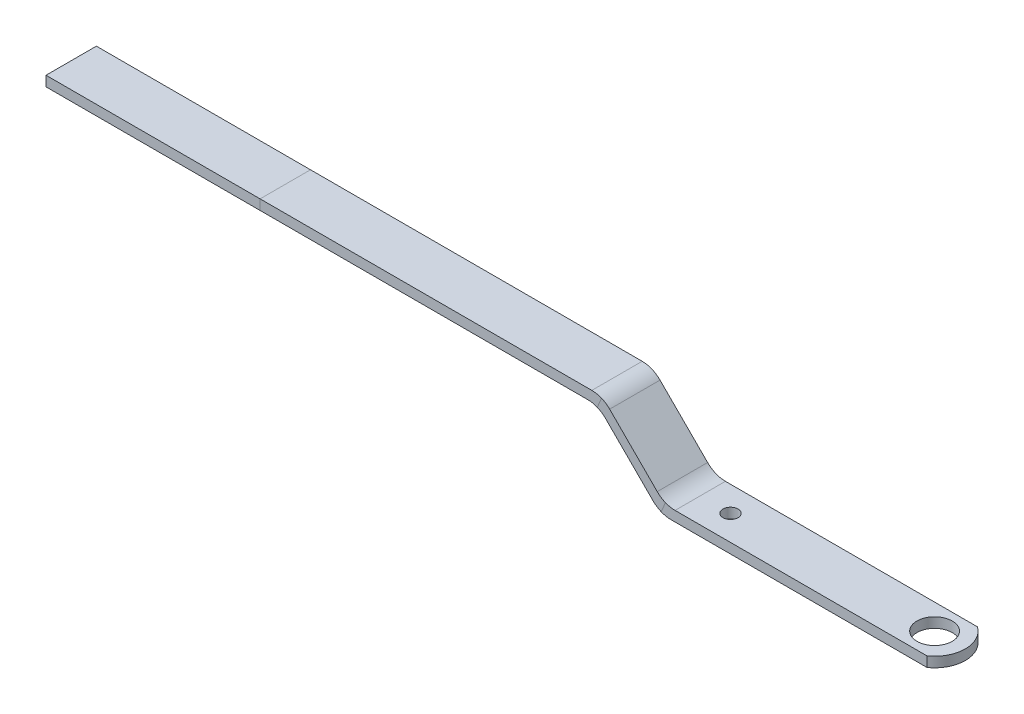
ISO-10303-21;
HEADER;
FILE_DESCRIPTION(('STEP AP214'),'2;1');
FILE_NAME('part.step','',(''),(''),'','','');
FILE_SCHEMA(('AUTOMOTIVE_DESIGN { 1 0 10303 214 1 1 1 1 }'));
ENDSEC;
DATA;
#1=APPLICATION_CONTEXT('core data for automotive mechanical design processes');
#2=APPLICATION_PROTOCOL_DEFINITION('international standard','automotive_design',2000,#1);
#3=PRODUCT_CONTEXT('',#1,'mechanical');
#4=PRODUCT('Part','Part','',(#3));
#5=PRODUCT_RELATED_PRODUCT_CATEGORY('part','',(#4));
#6=PRODUCT_DEFINITION_FORMATION('','',#4);
#7=PRODUCT_DEFINITION_CONTEXT('part definition',#1,'design');
#8=PRODUCT_DEFINITION('design','',#6,#7);
#9=PRODUCT_DEFINITION_SHAPE('','',#8);
#10=(LENGTH_UNIT() NAMED_UNIT(*) SI_UNIT(.MILLI.,.METRE.));
#11=(NAMED_UNIT(*) PLANE_ANGLE_UNIT() SI_UNIT($,.RADIAN.));
#12=(NAMED_UNIT(*) SI_UNIT($,.STERADIAN.) SOLID_ANGLE_UNIT());
#13=UNCERTAINTY_MEASURE_WITH_UNIT(LENGTH_MEASURE(1.E-05),#10,'distance_accuracy_value','');
#14=(GEOMETRIC_REPRESENTATION_CONTEXT(3) GLOBAL_UNCERTAINTY_ASSIGNED_CONTEXT((#13)) GLOBAL_UNIT_ASSIGNED_CONTEXT((#10,
#11,#12)) REPRESENTATION_CONTEXT('',''));
#15=CARTESIAN_POINT('',(0.,0.,0.));
#16=DIRECTION('',(0.,0.,1.));
#17=DIRECTION('',(1.,0.,0.));
#18=AXIS2_PLACEMENT_3D('',#15,#16,#17);
#19=CARTESIAN_POINT('',(-175.748737341529,22.748737341529,0.));
#20=DIRECTION('',(0.,-1.,0.));
#21=DIRECTION('',(1.,0.,0.));
#22=AXIS2_PLACEMENT_3D('',#19,#20,#21);
#23=DEGENERATE_TOROIDAL_SURFACE('',#22,1.99999999999999,2.,.T.);
#24=CARTESIAN_POINT('',(-175.748737341529,20.748737341529,0.));
#25=DIRECTION('',(0.,-1.,0.));
#26=DIRECTION('',(1.,0.,0.));
#27=AXIS2_PLACEMENT_3D('',#24,#25,#26);
#28=CIRCLE('',#27,1.99999999999999);
#29=CARTESIAN_POINT('',(-173.748737341529,20.748737341529,0.));
#30=VERTEX_POINT('',#29);
#31=EDGE_CURVE('E11',#30,#30,#28,.T.);
#32=ORIENTED_EDGE('',*,*,#31,.F.);
#33=EDGE_LOOP('',(#32));
#34=FACE_BOUND('',#33,.T.);
#35=CARTESIAN_POINT('',(-175.748737341529,22.748737341529,0.));
#36=DIRECTION('',(0.,1.,0.));
#37=DIRECTION('',(-1.,0.,0.));
#38=AXIS2_PLACEMENT_3D('',#35,#36,#37);
#39=CIRCLE('',#38,3.99999999999999);
#40=CARTESIAN_POINT('',(-179.748737341529,22.748737341529,0.));
#41=VERTEX_POINT('',#40);
#42=EDGE_CURVE('E47',#41,#41,#39,.F.);
#43=ORIENTED_EDGE('',*,*,#42,.T.);
#44=EDGE_LOOP('',(#43));
#45=FACE_BOUND('',#44,.T.);
#46=ADVANCED_FACE('F40',(#34,#45),#23,.T.);
#47=CARTESIAN_POINT('',(-244.748737341529,24.748737341529,0.));
#48=DIRECTION('',(-1.,0.,0.));
#49=DIRECTION('',(0.,0.,1.));
#50=AXIS2_PLACEMENT_3D('',#47,#48,#49);
#51=PLANE('',#50);
#52=DIRECTION('',(0.,1.,0.));
#53=VECTOR('',#52,1.);
#54=CARTESIAN_POINT('',(-244.748737341529,22.748737341529,-10.));
#55=LINE('',#54,#53);
#56=CARTESIAN_POINT('',(-244.748737341529,22.748737341529,-10.));
#57=VERTEX_POINT('',#56);
#58=CARTESIAN_POINT('',(-244.748737341529,26.748737341529,-10.));
#59=VERTEX_POINT('',#58);
#60=EDGE_CURVE('E251',#57,#59,#55,.T.);
#61=ORIENTED_EDGE('',*,*,#60,.F.);
#62=DIRECTION('',(0.,0.,-1.));
#63=VECTOR('',#62,1.);
#64=CARTESIAN_POINT('',(-244.748737341529,22.748737341529,10.));
#65=LINE('',#64,#63);
#66=CARTESIAN_POINT('',(-244.748737341529,22.748737341529,10.));
#67=VERTEX_POINT('',#66);
#68=EDGE_CURVE('E192',#67,#57,#65,.T.);
#69=ORIENTED_EDGE('',*,*,#68,.F.);
#70=DIRECTION('',(0.,-1.,0.));
#71=VECTOR('',#70,1.);
#72=CARTESIAN_POINT('',(-244.748737341529,22.748737341529,10.));
#73=LINE('',#72,#71);
#74=CARTESIAN_POINT('',(-244.748737341529,26.748737341529,10.));
#75=VERTEX_POINT('',#74);
#76=EDGE_CURVE('E235',#75,#67,#73,.T.);
#77=ORIENTED_EDGE('',*,*,#76,.F.);
#78=DIRECTION('',(0.,0.,1.));
#79=VECTOR('',#78,1.);
#80=CARTESIAN_POINT('',(-244.748737341529,26.748737341529,10.));
#81=LINE('',#80,#79);
#82=EDGE_CURVE('E243',#59,#75,#81,.T.);
#83=ORIENTED_EDGE('',*,*,#82,.F.);
#84=EDGE_LOOP('',(#61,#69,#77,#83));
#85=FACE_BOUND('',#84,.T.);
#86=ADVANCED_FACE('F333',(#85),#51,.T.);
#87=CARTESIAN_POINT('',(-23.7374675043085,22.748737341529,-10.));
#88=DIRECTION('',(0.,0.,1.));
#89=DIRECTION('',(1.,0.,0.));
#90=AXIS2_PLACEMENT_3D('',#87,#88,#89);
#91=PLANE('',#90);
#92=DIRECTION('',(-1.,0.,0.));
#93=VECTOR('',#92,1.);
#94=CARTESIAN_POINT('',(-23.7374675043085,26.748737341529,-10.));
#95=LINE('',#94,#93);
#96=CARTESIAN_POINT('',(-28.062445840514,26.748737341529,-10.));
#97=VERTEX_POINT('',#96);
#98=CARTESIAN_POINT('',(-159.748737341529,26.748737341529,-10.));
#99=VERTEX_POINT('',#98);
#100=EDGE_CURVE('E261',#97,#99,#95,.T.);
#101=ORIENTED_EDGE('',*,*,#100,.F.);
#102=CARTESIAN_POINT('',(-28.062445840514,16.748737341529,-10.));
#103=DIRECTION('',(0.,0.,1.));
#104=DIRECTION('',(1.,0.,0.));
#105=AXIS2_PLACEMENT_3D('',#102,#103,#104);
#106=CIRCLE('',#105,10.);
#107=CARTESIAN_POINT('',(-24.2356115168632,25.9875326666419,-10.));
#108=VERTEX_POINT('',#107);
#109=EDGE_CURVE('E273',#97,#108,#106,.F.);
#110=ORIENTED_EDGE('',*,*,#109,.T.);
#111=DIRECTION('',(-0.382683432365087,-0.923879532511288,0.));
#112=VECTOR('',#111,1.);
#113=CARTESIAN_POINT('',(-30.7295724908075,10.3097240098238,-10.));
#114=LINE('',#113,#112);
#115=CARTESIAN_POINT('',(-25.8924657663555,21.9875326666419,-10.));
#116=VERTEX_POINT('',#115);
#117=EDGE_CURVE('E54',#108,#116,#114,.T.);
#118=ORIENTED_EDGE('',*,*,#117,.T.);
#119=CARTESIAN_POINT('',(-29.7193000900064,12.748737341529,-10.));
#120=DIRECTION('',(0.,0.,1.));
#121=DIRECTION('',(1.,0.,0.));
#122=AXIS2_PLACEMENT_3D('',#119,#120,#121);
#123=CIRCLE('',#122,10.);
#124=CARTESIAN_POINT('',(-29.7193000900064,22.748737341529,-10.));
#125=VERTEX_POINT('',#124);
#126=EDGE_CURVE('E314',#116,#125,#123,.T.);
#127=ORIENTED_EDGE('',*,*,#126,.T.);
#128=DIRECTION('',(-1.,0.,0.));
#129=VECTOR('',#128,1.);
#130=CARTESIAN_POINT('',(-23.7374675043085,22.748737341529,-10.));
#131=LINE('',#130,#129);
#132=CARTESIAN_POINT('',(-159.748737341529,22.748737341529,-10.));
#133=VERTEX_POINT('',#132);
#134=EDGE_CURVE('E216',#125,#133,#131,.T.);
#135=ORIENTED_EDGE('',*,*,#134,.T.);
#136=DIRECTION('',(0.,1.,0.));
#137=VECTOR('',#136,1.);
#138=CARTESIAN_POINT('',(-159.748737341529,22.748737341529,-10.));
#139=LINE('',#138,#137);
#140=EDGE_CURVE('E248',#133,#99,#139,.T.);
#141=ORIENTED_EDGE('',*,*,#140,.T.);
#142=EDGE_LOOP('',(#101,#110,#118,#127,#135,#141));
#143=FACE_BOUND('',#142,.T.);
#144=ADVANCED_FACE('F340',(#143),#91,.F.);
#145=CARTESIAN_POINT('',(-23.7374675043085,26.748737341529,10.));
#146=DIRECTION('',(0.,-1.,0.));
#147=DIRECTION('',(1.,0.,0.));
#148=AXIS2_PLACEMENT_3D('',#145,#146,#147);
#149=PLANE('',#148);
#150=DIRECTION('',(-1.,0.,0.));
#151=VECTOR('',#150,1.);
#152=CARTESIAN_POINT('',(-23.7374675043085,26.748737341529,10.));
#153=LINE('',#152,#151);
#154=CARTESIAN_POINT('',(-28.062445840514,26.748737341529,10.));
#155=VERTEX_POINT('',#154);
#156=CARTESIAN_POINT('',(-159.748737341529,26.748737341529,10.));
#157=VERTEX_POINT('',#156);
#158=EDGE_CURVE('E259',#155,#157,#153,.T.);
#159=ORIENTED_EDGE('',*,*,#158,.F.);
#160=DIRECTION('',(0.,0.,-1.));
#161=VECTOR('',#160,1.);
#162=CARTESIAN_POINT('',(-28.062445840514,26.748737341529,10.));
#163=LINE('',#162,#161);
#164=EDGE_CURVE('E270',#155,#97,#163,.T.);
#165=ORIENTED_EDGE('',*,*,#164,.T.);
#166=ORIENTED_EDGE('',*,*,#100,.T.);
#167=DIRECTION('',(0.,0.,1.));
#168=VECTOR('',#167,1.);
#169=CARTESIAN_POINT('',(-159.748737341529,26.748737341529,10.));
#170=LINE('',#169,#168);
#171=EDGE_CURVE('E240',#99,#157,#170,.T.);
#172=ORIENTED_EDGE('',*,*,#171,.T.);
#173=EDGE_LOOP('',(#159,#165,#166,#172));
#174=FACE_BOUND('',#173,.T.);
#175=ADVANCED_FACE('F362',(#174),#149,.F.);
#176=CARTESIAN_POINT('',(-23.7374675043085,22.748737341529,10.));
#177=DIRECTION('',(0.,0.,-1.));
#178=DIRECTION('',(-1.,0.,0.));
#179=AXIS2_PLACEMENT_3D('',#176,#177,#178);
#180=PLANE('',#179);
#181=DIRECTION('',(0.382683432365087,0.923879532511288,0.));
#182=VECTOR('',#181,1.);
#183=CARTESIAN_POINT('',(-30.7295724908075,10.3097240098238,10.));
#184=LINE('',#183,#182);
#185=CARTESIAN_POINT('',(-25.8924657663555,21.9875326666419,10.));
#186=VERTEX_POINT('',#185);
#187=CARTESIAN_POINT('',(-24.2356115168632,25.9875326666419,10.));
#188=VERTEX_POINT('',#187);
#189=EDGE_CURVE('E62',#186,#188,#184,.T.);
#190=ORIENTED_EDGE('',*,*,#189,.T.);
#191=CARTESIAN_POINT('',(-28.062445840514,16.748737341529,10.));
#192=DIRECTION('',(0.,0.,-1.));
#193=DIRECTION('',(-1.,0.,0.));
#194=AXIS2_PLACEMENT_3D('',#191,#192,#193);
#195=CIRCLE('',#194,10.);
#196=EDGE_CURVE('E283',#188,#155,#195,.F.);
#197=ORIENTED_EDGE('',*,*,#196,.T.);
#198=ORIENTED_EDGE('',*,*,#158,.T.);
#199=DIRECTION('',(0.,-1.,0.));
#200=VECTOR('',#199,1.);
#201=CARTESIAN_POINT('',(-159.748737341529,22.748737341529,10.));
#202=LINE('',#201,#200);
#203=CARTESIAN_POINT('',(-159.748737341529,22.748737341529,10.));
#204=VERTEX_POINT('',#203);
#205=EDGE_CURVE('E231',#157,#204,#202,.T.);
#206=ORIENTED_EDGE('',*,*,#205,.T.);
#207=DIRECTION('',(-1.,0.,0.));
#208=VECTOR('',#207,1.);
#209=CARTESIAN_POINT('',(-23.7374675043085,22.748737341529,10.));
#210=LINE('',#209,#208);
#211=CARTESIAN_POINT('',(-29.7193000900064,22.748737341529,10.));
#212=VERTEX_POINT('',#211);
#213=EDGE_CURVE('E257',#212,#204,#210,.T.);
#214=ORIENTED_EDGE('',*,*,#213,.F.);
#215=CARTESIAN_POINT('',(-29.7193000900064,12.748737341529,10.));
#216=DIRECTION('',(0.,0.,-1.));
#217=DIRECTION('',(-1.,0.,0.));
#218=AXIS2_PLACEMENT_3D('',#215,#216,#217);
#219=CIRCLE('',#218,10.);
#220=EDGE_CURVE('E308',#212,#186,#219,.T.);
#221=ORIENTED_EDGE('',*,*,#220,.T.);
#222=EDGE_LOOP('',(#190,#197,#198,#206,#214,#221));
#223=FACE_BOUND('',#222,.T.);
#224=ADVANCED_FACE('F353',(#223),#180,.F.);
#225=CARTESIAN_POINT('',(-23.7374675043085,22.748737341529,10.));
#226=DIRECTION('',(0.,1.,0.));
#227=DIRECTION('',(-1.,0.,0.));
#228=AXIS2_PLACEMENT_3D('',#225,#226,#227);
#229=PLANE('',#228);
#230=ORIENTED_EDGE('',*,*,#134,.F.);
#231=DIRECTION('',(0.,0.,1.));
#232=VECTOR('',#231,1.);
#233=CARTESIAN_POINT('',(-29.7193000900064,22.748737341529,10.));
#234=LINE('',#233,#232);
#235=EDGE_CURVE('E296',#125,#212,#234,.T.);
#236=ORIENTED_EDGE('',*,*,#235,.T.);
#237=ORIENTED_EDGE('',*,*,#213,.T.);
#238=DIRECTION('',(0.,0.,-1.));
#239=VECTOR('',#238,1.);
#240=CARTESIAN_POINT('',(-159.748737341529,22.748737341529,10.));
#241=LINE('',#240,#239);
#242=EDGE_CURVE('E228',#204,#133,#241,.T.);
#243=ORIENTED_EDGE('',*,*,#242,.T.);
#244=EDGE_LOOP('',(#230,#236,#237,#243));
#245=FACE_BOUND('',#244,.T.);
#246=ADVANCED_FACE('F345',(#245),#229,.F.);
#247=CARTESIAN_POINT('',(-159.748737341529,22.748737341529,-10.));
#248=DIRECTION('',(0.,0.,1.));
#249=DIRECTION('',(1.,0.,0.));
#250=AXIS2_PLACEMENT_3D('',#247,#248,#249);
#251=PLANE('',#250);
#252=DIRECTION('',(-1.,0.,0.));
#253=VECTOR('',#252,1.);
#254=CARTESIAN_POINT('',(-159.748737341529,26.748737341529,-10.));
#255=LINE('',#254,#253);
#256=EDGE_CURVE('E245',#99,#59,#255,.T.);
#257=ORIENTED_EDGE('',*,*,#256,.F.);
#258=ORIENTED_EDGE('',*,*,#140,.F.);
#259=DIRECTION('',(-1.,0.,0.));
#260=VECTOR('',#259,1.);
#261=CARTESIAN_POINT('',(-159.748737341529,22.748737341529,-10.));
#262=LINE('',#261,#260);
#263=EDGE_CURVE('E232',#133,#57,#262,.T.);
#264=ORIENTED_EDGE('',*,*,#263,.T.);
#265=ORIENTED_EDGE('',*,*,#60,.T.);
#266=EDGE_LOOP('',(#257,#258,#264,#265));
#267=FACE_BOUND('',#266,.T.);
#268=ADVANCED_FACE('F337',(#267),#251,.F.);
#269=CARTESIAN_POINT('',(-159.748737341529,26.748737341529,10.));
#270=DIRECTION('',(0.,-1.,0.));
#271=DIRECTION('',(1.,0.,0.));
#272=AXIS2_PLACEMENT_3D('',#269,#270,#271);
#273=PLANE('',#272);
#274=DIRECTION('',(-1.,0.,0.));
#275=VECTOR('',#274,1.);
#276=CARTESIAN_POINT('',(-159.748737341529,26.748737341529,10.));
#277=LINE('',#276,#275);
#278=EDGE_CURVE('E237',#157,#75,#277,.T.);
#279=ORIENTED_EDGE('',*,*,#278,.F.);
#280=ORIENTED_EDGE('',*,*,#171,.F.);
#281=ORIENTED_EDGE('',*,*,#256,.T.);
#282=ORIENTED_EDGE('',*,*,#82,.T.);
#283=EDGE_LOOP('',(#279,#280,#281,#282));
#284=FACE_BOUND('',#283,.T.);
#285=ADVANCED_FACE('F359',(#284),#273,.F.);
#286=CARTESIAN_POINT('',(-159.748737341529,22.748737341529,10.));
#287=DIRECTION('',(0.,0.,-1.));
#288=DIRECTION('',(-1.,0.,0.));
#289=AXIS2_PLACEMENT_3D('',#286,#287,#288);
#290=PLANE('',#289);
#291=DIRECTION('',(-1.,0.,0.));
#292=VECTOR('',#291,1.);
#293=CARTESIAN_POINT('',(-159.748737341529,22.748737341529,10.));
#294=LINE('',#293,#292);
#295=EDGE_CURVE('E227',#204,#67,#294,.T.);
#296=ORIENTED_EDGE('',*,*,#295,.F.);
#297=ORIENTED_EDGE('',*,*,#205,.F.);
#298=ORIENTED_EDGE('',*,*,#278,.T.);
#299=ORIENTED_EDGE('',*,*,#76,.T.);
#300=EDGE_LOOP('',(#296,#297,#298,#299));
#301=FACE_BOUND('',#300,.T.);
#302=ADVANCED_FACE('F323',(#301),#290,.F.);
#303=CARTESIAN_POINT('',(-159.748737341529,22.748737341529,10.));
#304=DIRECTION('',(0.,1.,0.));
#305=DIRECTION('',(-1.,0.,0.));
#306=AXIS2_PLACEMENT_3D('',#303,#304,#305);
#307=PLANE('',#306);
#308=ORIENTED_EDGE('',*,*,#42,.F.);
#309=EDGE_LOOP('',(#308));
#310=FACE_BOUND('',#309,.T.);
#311=ORIENTED_EDGE('',*,*,#68,.T.);
#312=ORIENTED_EDGE('',*,*,#263,.F.);
#313=ORIENTED_EDGE('',*,*,#242,.F.);
#314=ORIENTED_EDGE('',*,*,#295,.T.);
#315=EDGE_LOOP('',(#311,#312,#313,#314));
#316=FACE_BOUND('',#315,.T.);
#317=ADVANCED_FACE('F319',(#310,#316),#307,.F.);
#318=CARTESIAN_POINT('',(-0.699137802864833,-2.12928932188133,10.));
#319=DIRECTION('',(0.707106781186544,0.707106781186551,0.));
#320=DIRECTION('',(-0.707106781186551,0.707106781186544,0.));
#321=AXIS2_PLACEMENT_3D('',#318,#319,#320);
#322=PLANE('',#321);
#323=DIRECTION('',(-0.707106781186551,0.707106781186544,0.));
#324=VECTOR('',#323,1.);
#325=CARTESIAN_POINT('',(-0.699137802864833,-2.12928932188133,-10.));
#326=LINE('',#325,#324);
#327=CARTESIAN_POINT('',(-3.75735931288069,0.928932188134485,-10.));
#328=VERTEX_POINT('',#327);
#329=CARTESIAN_POINT('',(-22.6482322781409,19.8198051533945,-10.));
#330=VERTEX_POINT('',#329);
#331=EDGE_CURVE('E222',#328,#330,#326,.T.);
#332=ORIENTED_EDGE('',*,*,#331,.F.);
#333=DIRECTION('',(0.,0.,1.));
#334=VECTOR('',#333,1.);
#335=CARTESIAN_POINT('',(-3.75735931288069,0.928932188134486,10.));
#336=LINE('',#335,#334);
#337=CARTESIAN_POINT('',(-3.75735931288069,0.928932188134485,10.));
#338=VERTEX_POINT('',#337);
#339=EDGE_CURVE('E287',#328,#338,#336,.T.);
#340=ORIENTED_EDGE('',*,*,#339,.T.);
#341=DIRECTION('',(-0.707106781186551,0.707106781186544,0.));
#342=VECTOR('',#341,1.);
#343=CARTESIAN_POINT('',(-0.699137802864833,-2.12928932188133,10.));
#344=LINE('',#343,#342);
#345=CARTESIAN_POINT('',(-22.6482322781409,19.8198051533945,10.));
#346=VERTEX_POINT('',#345);
#347=EDGE_CURVE('E212',#338,#346,#344,.T.);
#348=ORIENTED_EDGE('',*,*,#347,.T.);
#349=DIRECTION('',(0.,0.,1.));
#350=VECTOR('',#349,1.);
#351=CARTESIAN_POINT('',(-22.6482322781409,19.8198051533945,-10.));
#352=LINE('',#351,#350);
#353=EDGE_CURVE('E285',#346,#330,#352,.F.);
#354=ORIENTED_EDGE('',*,*,#353,.T.);
#355=EDGE_LOOP('',(#332,#340,#348,#354));
#356=FACE_BOUND('',#355,.T.);
#357=ADVANCED_FACE('F322',(#356),#322,.F.);
#358=CARTESIAN_POINT('',(-0.699137802864833,-2.12928932188133,10.));
#359=DIRECTION('',(0.,0.,-1.));
#360=DIRECTION('',(-1.,0.,0.));
#361=AXIS2_PLACEMENT_3D('',#358,#359,#360);
#362=PLANE('',#361);
#363=DIRECTION('',(-0.707106781186551,0.707106781186544,0.));
#364=VECTOR('',#363,1.);
#365=CARTESIAN_POINT('',(2.12928932188135,0.699137802864874,10.));
#366=LINE('',#365,#364);
#367=CARTESIAN_POINT('',(-2.10050506338831,4.92893218813449,10.));
#368=VERTEX_POINT('',#367);
#369=CARTESIAN_POINT('',(-20.9913780286486,23.8198051533945,10.));
#370=VERTEX_POINT('',#369);
#371=EDGE_CURVE('E215',#368,#370,#366,.T.);
#372=ORIENTED_EDGE('',*,*,#371,.T.);
#373=CARTESIAN_POINT('',(-28.062445840514,16.748737341529,10.));
#374=DIRECTION('',(0.,0.,-1.));
#375=DIRECTION('',(-1.,0.,0.));
#376=AXIS2_PLACEMENT_3D('',#373,#374,#375);
#377=CIRCLE('',#376,10.);
#378=EDGE_CURVE('E281',#370,#188,#377,.F.);
#379=ORIENTED_EDGE('',*,*,#378,.T.);
#380=ORIENTED_EDGE('',*,*,#189,.F.);
#381=CARTESIAN_POINT('',(-29.7193000900064,12.748737341529,10.));
#382=DIRECTION('',(0.,0.,-1.));
#383=DIRECTION('',(-1.,0.,0.));
#384=AXIS2_PLACEMENT_3D('',#381,#382,#383);
#385=CIRCLE('',#384,10.);
#386=EDGE_CURVE('E310',#186,#346,#385,.T.);
#387=ORIENTED_EDGE('',*,*,#386,.T.);
#388=ORIENTED_EDGE('',*,*,#347,.F.);
#389=CARTESIAN_POINT('',(3.31370849898475,8.,10.));
#390=DIRECTION('',(0.,0.,-1.));
#391=DIRECTION('',(-1.,0.,0.));
#392=AXIS2_PLACEMENT_3D('',#389,#390,#391);
#393=CIRCLE('',#392,10.);
#394=CARTESIAN_POINT('',(-0.513125824666144,-1.23879532511287,10.));
#395=VERTEX_POINT('',#394);
#396=EDGE_CURVE('E279',#338,#395,#393,.F.);
#397=ORIENTED_EDGE('',*,*,#396,.T.);
#398=DIRECTION('',(0.382683432365087,0.923879532511288,0.));
#399=VECTOR('',#398,1.);
#400=CARTESIAN_POINT('',(14.6697872065195,35.415999231107,10.));
#401=LINE('',#400,#399);
#402=CARTESIAN_POINT('',(1.14372842482623,2.76120467488714,10.));
#403=VERTEX_POINT('',#402);
#404=EDGE_CURVE('E199',#395,#403,#401,.T.);
#405=ORIENTED_EDGE('',*,*,#404,.T.);
#406=CARTESIAN_POINT('',(4.97056274847713,12.,10.));
#407=DIRECTION('',(0.,0.,-1.));
#408=DIRECTION('',(-1.,0.,0.));
#409=AXIS2_PLACEMENT_3D('',#406,#407,#408);
#410=CIRCLE('',#409,10.);
#411=EDGE_CURVE('E306',#403,#368,#410,.T.);
#412=ORIENTED_EDGE('',*,*,#411,.T.);
#413=EDGE_LOOP('',(#372,#379,#380,#387,#388,#397,#405,#412));
#414=FACE_BOUND('',#413,.T.);
#415=ADVANCED_FACE('F376',(#414),#362,.F.);
#416=CARTESIAN_POINT('',(2.12928932188135,0.699137802864874,10.));
#417=DIRECTION('',(-0.707106781186544,-0.707106781186551,0.));
#418=DIRECTION('',(0.707106781186551,-0.707106781186544,0.));
#419=AXIS2_PLACEMENT_3D('',#416,#417,#418);
#420=PLANE('',#419);
#421=ORIENTED_EDGE('',*,*,#371,.F.);
#422=DIRECTION('',(0.,0.,-1.));
#423=VECTOR('',#422,1.);
#424=CARTESIAN_POINT('',(-2.10050506338831,4.92893218813449,-10.));
#425=LINE('',#424,#423);
#426=CARTESIAN_POINT('',(-2.10050506338831,4.92893218813449,-10.));
#427=VERTEX_POINT('',#426);
#428=EDGE_CURVE('E265',#368,#427,#425,.T.);
#429=ORIENTED_EDGE('',*,*,#428,.T.);
#430=DIRECTION('',(-0.707106781186551,0.707106781186544,0.));
#431=VECTOR('',#430,1.);
#432=CARTESIAN_POINT('',(2.12928932188135,0.699137802864874,-10.));
#433=LINE('',#432,#431);
#434=CARTESIAN_POINT('',(-20.9913780286486,23.8198051533945,-10.));
#435=VERTEX_POINT('',#434);
#436=EDGE_CURVE('E219',#427,#435,#433,.T.);
#437=ORIENTED_EDGE('',*,*,#436,.T.);
#438=DIRECTION('',(0.,0.,-1.));
#439=VECTOR('',#438,1.);
#440=CARTESIAN_POINT('',(-20.9913780286486,23.8198051533945,10.));
#441=LINE('',#440,#439);
#442=EDGE_CURVE('E200',#435,#370,#441,.F.);
#443=ORIENTED_EDGE('',*,*,#442,.T.);
#444=EDGE_LOOP('',(#421,#429,#437,#443));
#445=FACE_BOUND('',#444,.T.);
#446=ADVANCED_FACE('F395',(#445),#420,.F.);
#447=CARTESIAN_POINT('',(-0.699137802864833,-2.12928932188133,-10.));
#448=DIRECTION('',(0.,0.,1.));
#449=DIRECTION('',(1.,0.,0.));
#450=AXIS2_PLACEMENT_3D('',#447,#448,#449);
#451=PLANE('',#450);
#452=ORIENTED_EDGE('',*,*,#117,.F.);
#453=CARTESIAN_POINT('',(-28.062445840514,16.748737341529,-10.));
#454=DIRECTION('',(0.,0.,1.));
#455=DIRECTION('',(1.,0.,0.));
#456=AXIS2_PLACEMENT_3D('',#453,#454,#455);
#457=CIRCLE('',#456,10.);
#458=EDGE_CURVE('E277',#108,#435,#457,.F.);
#459=ORIENTED_EDGE('',*,*,#458,.T.);
#460=ORIENTED_EDGE('',*,*,#436,.F.);
#461=CARTESIAN_POINT('',(4.97056274847713,12.,-10.));
#462=DIRECTION('',(0.,0.,1.));
#463=DIRECTION('',(1.,0.,0.));
#464=AXIS2_PLACEMENT_3D('',#461,#462,#463);
#465=CIRCLE('',#464,10.);
#466=CARTESIAN_POINT('',(1.14372842482623,2.76120467488714,-10.));
#467=VERTEX_POINT('',#466);
#468=EDGE_CURVE('E299',#427,#467,#465,.T.);
#469=ORIENTED_EDGE('',*,*,#468,.T.);
#470=DIRECTION('',(-0.382683432365087,-0.923879532511288,0.));
#471=VECTOR('',#470,1.);
#472=CARTESIAN_POINT('',(14.6697872065195,35.415999231107,-10.));
#473=LINE('',#472,#471);
#474=CARTESIAN_POINT('',(-0.513125824666144,-1.23879532511287,-10.));
#475=VERTEX_POINT('',#474);
#476=EDGE_CURVE('E201',#467,#475,#473,.T.);
#477=ORIENTED_EDGE('',*,*,#476,.T.);
#478=CARTESIAN_POINT('',(3.31370849898475,8.,-10.));
#479=DIRECTION('',(0.,0.,1.));
#480=DIRECTION('',(1.,0.,0.));
#481=AXIS2_PLACEMENT_3D('',#478,#479,#480);
#482=CIRCLE('',#481,10.);
#483=EDGE_CURVE('E275',#475,#328,#482,.F.);
#484=ORIENTED_EDGE('',*,*,#483,.T.);
#485=ORIENTED_EDGE('',*,*,#331,.T.);
#486=CARTESIAN_POINT('',(-29.7193000900064,12.748737341529,-10.));
#487=DIRECTION('',(0.,0.,1.));
#488=DIRECTION('',(1.,0.,0.));
#489=AXIS2_PLACEMENT_3D('',#486,#487,#488);
#490=CIRCLE('',#489,10.);
#491=EDGE_CURVE('E312',#330,#116,#490,.T.);
#492=ORIENTED_EDGE('',*,*,#491,.T.);
#493=EDGE_LOOP('',(#452,#459,#460,#469,#477,#484,#485,#492));
#494=FACE_BOUND('',#493,.T.);
#495=ADVANCED_FACE('F370',(#494),#451,.F.);
#496=CARTESIAN_POINT('',(105.,-2.,10.));
#497=DIRECTION('',(0.,1.,0.));
#498=DIRECTION('',(0.,0.,1.));
#499=AXIS2_PLACEMENT_3D('',#496,#497,#498);
#500=PLANE('',#499);
#501=CARTESIAN_POINT('',(98.,-2.,0.));
#502=DIRECTION('',(0.,1.,0.));
#503=DIRECTION('',(0.,0.,1.));
#504=AXIS2_PLACEMENT_3D('',#501,#502,#503);
#505=CIRCLE('',#504,7.);
#506=CARTESIAN_POINT('',(98.,-2.,7.));
#507=VERTEX_POINT('',#506);
#508=EDGE_CURVE('E190',#507,#507,#505,.T.);
#509=ORIENTED_EDGE('',*,*,#508,.T.);
#510=EDGE_LOOP('',(#509));
#511=FACE_BOUND('',#510,.T.);
#512=CARTESIAN_POINT('',(17.,-2.,0.));
#513=DIRECTION('',(0.,1.,0.));
#514=DIRECTION('',(0.,0.,1.));
#515=AXIS2_PLACEMENT_3D('',#512,#513,#514);
#516=CIRCLE('',#515,3.);
#517=CARTESIAN_POINT('',(17.,-2.,3.));
#518=VERTEX_POINT('',#517);
#519=EDGE_CURVE('E433',#518,#518,#516,.T.);
#520=ORIENTED_EDGE('',*,*,#519,.T.);
#521=EDGE_LOOP('',(#520));
#522=FACE_BOUND('',#521,.T.);
#523=DIRECTION('',(-1.,0.,0.));
#524=VECTOR('',#523,1.);
#525=CARTESIAN_POINT('',(105.,-2.,10.));
#526=LINE('',#525,#524);
#527=CARTESIAN_POINT('',(105.,-2.,10.));
#528=VERTEX_POINT('',#527);
#529=CARTESIAN_POINT('',(3.31370849898475,-2.,10.));
#530=VERTEX_POINT('',#529);
#531=EDGE_CURVE('E205',#528,#530,#526,.T.);
#532=ORIENTED_EDGE('',*,*,#531,.T.);
#533=DIRECTION('',(0.,0.,1.));
#534=VECTOR('',#533,1.);
#535=CARTESIAN_POINT('',(3.31370849898475,-2.,10.));
#536=LINE('',#535,#534);
#537=CARTESIAN_POINT('',(3.31370849898475,-2.,-10.));
#538=VERTEX_POINT('',#537);
#539=EDGE_CURVE('E292',#530,#538,#536,.F.);
#540=ORIENTED_EDGE('',*,*,#539,.T.);
#541=DIRECTION('',(-1.,0.,0.));
#542=VECTOR('',#541,1.);
#543=CARTESIAN_POINT('',(105.,-2.,-10.));
#544=LINE('',#543,#542);
#545=CARTESIAN_POINT('',(105.,-2.,-10.));
#546=VERTEX_POINT('',#545);
#547=EDGE_CURVE('E175',#546,#538,#544,.T.);
#548=ORIENTED_EDGE('',*,*,#547,.F.);
#549=CARTESIAN_POINT('',(98.,-2.,0.));
#550=DIRECTION('',(0.,1.,0.));
#551=DIRECTION('',(0.,0.,1.));
#552=AXIS2_PLACEMENT_3D('',#549,#550,#551);
#553=CIRCLE('',#552,12.2065556157337);
#554=EDGE_CURVE('E184',#528,#546,#553,.T.);
#555=ORIENTED_EDGE('',*,*,#554,.F.);
#556=EDGE_LOOP('',(#532,#540,#548,#555));
#557=FACE_BOUND('',#556,.T.);
#558=ADVANCED_FACE('F389',(#511,#522,#557),#500,.F.);
#559=CARTESIAN_POINT('',(105.,-2.,10.));
#560=DIRECTION('',(0.,0.,-1.));
#561=DIRECTION('',(-1.,0.,0.));
#562=AXIS2_PLACEMENT_3D('',#559,#560,#561);
#563=PLANE('',#562);
#564=ORIENTED_EDGE('',*,*,#404,.F.);
#565=CARTESIAN_POINT('',(3.31370849898475,8.,10.));
#566=DIRECTION('',(0.,0.,-1.));
#567=DIRECTION('',(-1.,0.,0.));
#568=AXIS2_PLACEMENT_3D('',#565,#566,#567);
#569=CIRCLE('',#568,10.);
#570=EDGE_CURVE('E290',#395,#530,#569,.F.);
#571=ORIENTED_EDGE('',*,*,#570,.T.);
#572=ORIENTED_EDGE('',*,*,#531,.F.);
#573=DIRECTION('',(0.,-1.,0.));
#574=VECTOR('',#573,1.);
#575=CARTESIAN_POINT('',(105.,-2.,10.));
#576=LINE('',#575,#574);
#577=CARTESIAN_POINT('',(105.,2.,10.));
#578=VERTEX_POINT('',#577);
#579=EDGE_CURVE('E185',#578,#528,#576,.T.);
#580=ORIENTED_EDGE('',*,*,#579,.F.);
#581=DIRECTION('',(-1.,0.,0.));
#582=VECTOR('',#581,1.);
#583=CARTESIAN_POINT('',(105.,2.,10.));
#584=LINE('',#583,#582);
#585=CARTESIAN_POINT('',(4.97056274847712,2.,10.));
#586=VERTEX_POINT('',#585);
#587=EDGE_CURVE('E174',#578,#586,#584,.T.);
#588=ORIENTED_EDGE('',*,*,#587,.T.);
#589=CARTESIAN_POINT('',(4.97056274847713,12.,10.));
#590=DIRECTION('',(0.,0.,-1.));
#591=DIRECTION('',(-1.,0.,0.));
#592=AXIS2_PLACEMENT_3D('',#589,#590,#591);
#593=CIRCLE('',#592,10.);
#594=EDGE_CURVE('E303',#586,#403,#593,.T.);
#595=ORIENTED_EDGE('',*,*,#594,.T.);
#596=EDGE_LOOP('',(#564,#571,#572,#580,#588,#595));
#597=FACE_BOUND('',#596,.T.);
#598=ADVANCED_FACE('F381',(#597),#563,.F.);
#599=CARTESIAN_POINT('',(105.,2.,10.));
#600=DIRECTION('',(0.,-1.,0.));
#601=DIRECTION('',(0.,0.,-1.));
#602=AXIS2_PLACEMENT_3D('',#599,#600,#601);
#603=PLANE('',#602);
#604=CARTESIAN_POINT('',(98.,2.,0.));
#605=DIRECTION('',(0.,1.,0.));
#606=DIRECTION('',(0.,0.,1.));
#607=AXIS2_PLACEMENT_3D('',#604,#605,#606);
#608=CIRCLE('',#607,7.);
#609=CARTESIAN_POINT('',(98.,2.,7.));
#610=VERTEX_POINT('',#609);
#611=EDGE_CURVE('E195',#610,#610,#608,.T.);
#612=ORIENTED_EDGE('',*,*,#611,.F.);
#613=EDGE_LOOP('',(#612));
#614=FACE_BOUND('',#613,.T.);
#615=CARTESIAN_POINT('',(17.,2.,0.));
#616=DIRECTION('',(0.,1.,0.));
#617=DIRECTION('',(0.,0.,1.));
#618=AXIS2_PLACEMENT_3D('',#615,#616,#617);
#619=CIRCLE('',#618,3.);
#620=CARTESIAN_POINT('',(17.,2.,3.));
#621=VERTEX_POINT('',#620);
#622=EDGE_CURVE('E435',#621,#621,#619,.T.);
#623=ORIENTED_EDGE('',*,*,#622,.F.);
#624=EDGE_LOOP('',(#623));
#625=FACE_BOUND('',#624,.T.);
#626=DIRECTION('',(-1.,0.,0.));
#627=VECTOR('',#626,1.);
#628=CARTESIAN_POINT('',(105.,2.,-10.));
#629=LINE('',#628,#627);
#630=CARTESIAN_POINT('',(105.,2.,-10.));
#631=VERTEX_POINT('',#630);
#632=CARTESIAN_POINT('',(4.97056274847712,2.,-10.));
#633=VERTEX_POINT('',#632);
#634=EDGE_CURVE('E163',#631,#633,#629,.T.);
#635=ORIENTED_EDGE('',*,*,#634,.T.);
#636=DIRECTION('',(0.,0.,-1.));
#637=VECTOR('',#636,1.);
#638=CARTESIAN_POINT('',(4.97056274847713,2.,10.));
#639=LINE('',#638,#637);
#640=EDGE_CURVE('E268',#633,#586,#639,.F.);
#641=ORIENTED_EDGE('',*,*,#640,.T.);
#642=ORIENTED_EDGE('',*,*,#587,.F.);
#643=CARTESIAN_POINT('',(98.,2.,0.));
#644=DIRECTION('',(0.,1.,0.));
#645=DIRECTION('',(0.,0.,1.));
#646=AXIS2_PLACEMENT_3D('',#643,#644,#645);
#647=CIRCLE('',#646,12.2065556157337);
#648=EDGE_CURVE('E182',#578,#631,#647,.T.);
#649=ORIENTED_EDGE('',*,*,#648,.T.);
#650=EDGE_LOOP('',(#635,#641,#642,#649));
#651=FACE_BOUND('',#650,.T.);
#652=ADVANCED_FACE('F188',(#614,#625,#651),#603,.F.);
#653=CARTESIAN_POINT('',(105.,-2.,-10.));
#654=DIRECTION('',(0.,0.,1.));
#655=DIRECTION('',(1.,0.,0.));
#656=AXIS2_PLACEMENT_3D('',#653,#654,#655);
#657=PLANE('',#656);
#658=ORIENTED_EDGE('',*,*,#547,.T.);
#659=CARTESIAN_POINT('',(3.31370849898475,8.,-10.));
#660=DIRECTION('',(0.,0.,1.));
#661=DIRECTION('',(1.,0.,0.));
#662=AXIS2_PLACEMENT_3D('',#659,#660,#661);
#663=CIRCLE('',#662,10.);
#664=EDGE_CURVE('E294',#538,#475,#663,.F.);
#665=ORIENTED_EDGE('',*,*,#664,.T.);
#666=ORIENTED_EDGE('',*,*,#476,.F.);
#667=CARTESIAN_POINT('',(4.97056274847713,12.,-10.));
#668=DIRECTION('',(0.,0.,1.));
#669=DIRECTION('',(1.,0.,0.));
#670=AXIS2_PLACEMENT_3D('',#667,#668,#669);
#671=CIRCLE('',#670,10.);
#672=EDGE_CURVE('E170',#467,#633,#671,.T.);
#673=ORIENTED_EDGE('',*,*,#672,.T.);
#674=ORIENTED_EDGE('',*,*,#634,.F.);
#675=DIRECTION('',(0.,1.,0.));
#676=VECTOR('',#675,1.);
#677=CARTESIAN_POINT('',(105.,-2.,-10.));
#678=LINE('',#677,#676);
#679=EDGE_CURVE('E167',#546,#631,#678,.T.);
#680=ORIENTED_EDGE('',*,*,#679,.F.);
#681=EDGE_LOOP('',(#658,#665,#666,#673,#674,#680));
#682=FACE_BOUND('',#681,.T.);
#683=ADVANCED_FACE('F166',(#682),#657,.F.);
#684=CARTESIAN_POINT('',(4.97056274847713,12.,10.));
#685=DIRECTION('',(0.,0.,1.));
#686=DIRECTION('',(1.,0.,0.));
#687=AXIS2_PLACEMENT_3D('',#684,#685,#686);
#688=CYLINDRICAL_SURFACE('',#687,10.);
#689=ORIENTED_EDGE('',*,*,#594,.F.);
#690=ORIENTED_EDGE('',*,*,#640,.F.);
#691=ORIENTED_EDGE('',*,*,#672,.F.);
#692=ORIENTED_EDGE('',*,*,#468,.F.);
#693=ORIENTED_EDGE('',*,*,#428,.F.);
#694=ORIENTED_EDGE('',*,*,#411,.F.);
#695=EDGE_LOOP('',(#689,#690,#691,#692,#693,#694));
#696=FACE_BOUND('',#695,.T.);
#697=ADVANCED_FACE('F392',(#696),#688,.F.);
#698=CARTESIAN_POINT('',(-28.062445840514,16.748737341529,10.));
#699=DIRECTION('',(0.,0.,-1.));
#700=DIRECTION('',(-1.,0.,0.));
#701=AXIS2_PLACEMENT_3D('',#698,#699,#700);
#702=CYLINDRICAL_SURFACE('',#701,10.);
#703=ORIENTED_EDGE('',*,*,#378,.F.);
#704=ORIENTED_EDGE('',*,*,#442,.F.);
#705=ORIENTED_EDGE('',*,*,#458,.F.);
#706=ORIENTED_EDGE('',*,*,#109,.F.);
#707=ORIENTED_EDGE('',*,*,#164,.F.);
#708=ORIENTED_EDGE('',*,*,#196,.F.);
#709=EDGE_LOOP('',(#703,#704,#705,#706,#707,#708));
#710=FACE_BOUND('',#709,.T.);
#711=ADVANCED_FACE('F366',(#710),#702,.T.);
#712=CARTESIAN_POINT('',(3.31370849898475,8.,10.));
#713=DIRECTION('',(0.,0.,1.));
#714=DIRECTION('',(1.,0.,0.));
#715=AXIS2_PLACEMENT_3D('',#712,#713,#714);
#716=CYLINDRICAL_SURFACE('',#715,10.);
#717=ORIENTED_EDGE('',*,*,#664,.F.);
#718=ORIENTED_EDGE('',*,*,#539,.F.);
#719=ORIENTED_EDGE('',*,*,#570,.F.);
#720=ORIENTED_EDGE('',*,*,#396,.F.);
#721=ORIENTED_EDGE('',*,*,#339,.F.);
#722=ORIENTED_EDGE('',*,*,#483,.F.);
#723=EDGE_LOOP('',(#717,#718,#719,#720,#721,#722));
#724=FACE_BOUND('',#723,.T.);
#725=ADVANCED_FACE('F386',(#724),#716,.T.);
#726=CARTESIAN_POINT('',(-29.7193000900064,12.748737341529,10.));
#727=DIRECTION('',(0.,0.,-1.));
#728=DIRECTION('',(-1.,0.,0.));
#729=AXIS2_PLACEMENT_3D('',#726,#727,#728);
#730=CYLINDRICAL_SURFACE('',#729,10.);
#731=ORIENTED_EDGE('',*,*,#491,.F.);
#732=ORIENTED_EDGE('',*,*,#353,.F.);
#733=ORIENTED_EDGE('',*,*,#386,.F.);
#734=ORIENTED_EDGE('',*,*,#220,.F.);
#735=ORIENTED_EDGE('',*,*,#235,.F.);
#736=ORIENTED_EDGE('',*,*,#126,.F.);
#737=EDGE_LOOP('',(#731,#732,#733,#734,#735,#736));
#738=FACE_BOUND('',#737,.T.);
#739=ADVANCED_FACE('F349',(#738),#730,.F.);
#740=CARTESIAN_POINT('',(98.,-2.,0.));
#741=DIRECTION('',(0.,1.,0.));
#742=DIRECTION('',(0.,0.,1.));
#743=AXIS2_PLACEMENT_3D('',#740,#741,#742);
#744=CYLINDRICAL_SURFACE('',#743,12.2065556157337);
#745=ORIENTED_EDGE('',*,*,#648,.F.);
#746=ORIENTED_EDGE('',*,*,#579,.T.);
#747=ORIENTED_EDGE('',*,*,#554,.T.);
#748=ORIENTED_EDGE('',*,*,#679,.T.);
#749=EDGE_LOOP('',(#745,#746,#747,#748));
#750=FACE_BOUND('',#749,.T.);
#751=ADVANCED_FACE('F180',(#750),#744,.T.);
#752=CARTESIAN_POINT('',(17.,-2.,0.));
#753=DIRECTION('',(0.,1.,0.));
#754=DIRECTION('',(0.,0.,1.));
#755=AXIS2_PLACEMENT_3D('',#752,#753,#754);
#756=CYLINDRICAL_SURFACE('',#755,3.);
#757=ORIENTED_EDGE('',*,*,#519,.F.);
#758=EDGE_LOOP('',(#757));
#759=FACE_BOUND('',#758,.T.);
#760=ORIENTED_EDGE('',*,*,#622,.T.);
#761=EDGE_LOOP('',(#760));
#762=FACE_BOUND('',#761,.T.);
#763=ADVANCED_FACE('F442',(#759,#762),#756,.F.);
#764=CARTESIAN_POINT('',(98.,-2.,0.));
#765=DIRECTION('',(0.,1.,0.));
#766=DIRECTION('',(0.,0.,1.));
#767=AXIS2_PLACEMENT_3D('',#764,#765,#766);
#768=CYLINDRICAL_SURFACE('',#767,7.);
#769=ORIENTED_EDGE('',*,*,#508,.F.);
#770=EDGE_LOOP('',(#769));
#771=FACE_BOUND('',#770,.T.);
#772=ORIENTED_EDGE('',*,*,#611,.T.);
#773=EDGE_LOOP('',(#772));
#774=FACE_BOUND('',#773,.T.);
#775=ADVANCED_FACE('F445',(#771,#774),#768,.F.);
#776=CARTESIAN_POINT('',(-175.748737341529,20.748737341529,0.));
#777=DIRECTION('',(0.,-1.,0.));
#778=DIRECTION('',(1.,0.,0.));
#779=AXIS2_PLACEMENT_3D('',#776,#777,#778);
#780=PLANE('',#779);
#781=ORIENTED_EDGE('',*,*,#31,.T.);
#782=EDGE_LOOP('',(#781));
#783=FACE_BOUND('',#782,.T.);
#784=ADVANCED_FACE('F450',(#783),#780,.T.);
#785=CLOSED_SHELL('',(#46,#86,#144,#175,#224,#246,#268,#285,#302,#317,#357,#415,#446,#495,#558,
#598,#652,#683,#697,#711,#725,#739,#751,#763,#775,#784));
#786=MANIFOLD_SOLID_BREP('B2',#785);
#787=ADVANCED_BREP_SHAPE_REPRESENTATION('',(#18,#786),#14);
#788=SHAPE_DEFINITION_REPRESENTATION(#9,#787);
ENDSEC;
END-ISO-10303-21;
